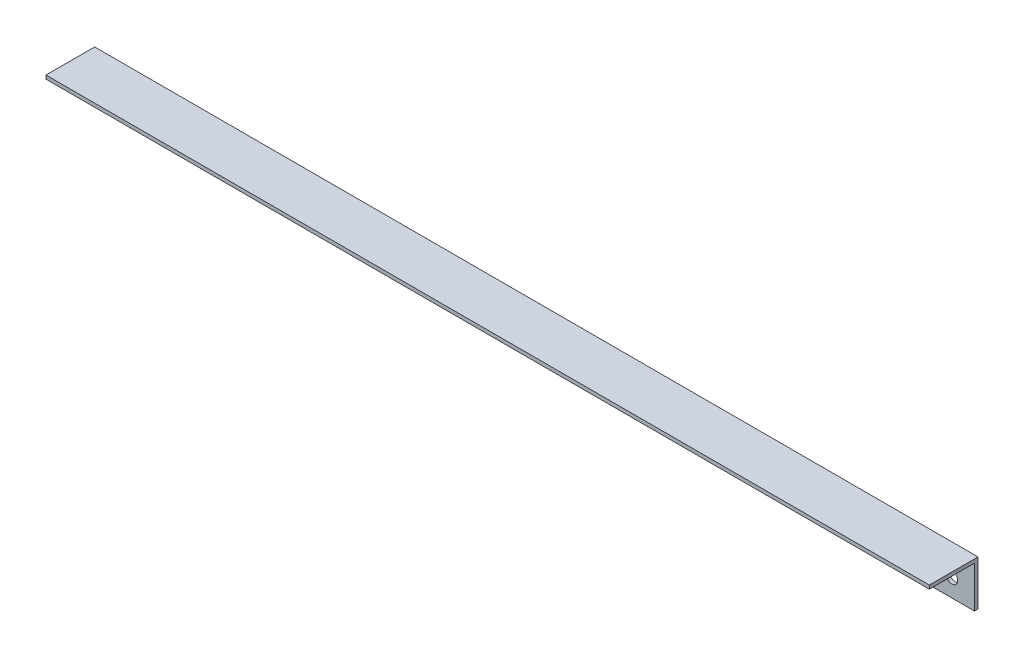
ISO-10303-21;
HEADER;
FILE_DESCRIPTION(('STEP AP214'),'2;1');
FILE_NAME('part.step','',(''),(''),'','','');
FILE_SCHEMA(('AUTOMOTIVE_DESIGN { 1 0 10303 214 1 1 1 1 }'));
ENDSEC;
DATA;
#1=APPLICATION_CONTEXT('core data for automotive mechanical design processes');
#2=APPLICATION_PROTOCOL_DEFINITION('international standard','automotive_design',2000,#1);
#3=PRODUCT_CONTEXT('',#1,'mechanical');
#4=PRODUCT('Part','Part','',(#3));
#5=PRODUCT_RELATED_PRODUCT_CATEGORY('part','',(#4));
#6=PRODUCT_DEFINITION_FORMATION('','',#4);
#7=PRODUCT_DEFINITION_CONTEXT('part definition',#1,'design');
#8=PRODUCT_DEFINITION('design','',#6,#7);
#9=PRODUCT_DEFINITION_SHAPE('','',#8);
#10=(LENGTH_UNIT() NAMED_UNIT(*) SI_UNIT(.MILLI.,.METRE.));
#11=(NAMED_UNIT(*) PLANE_ANGLE_UNIT() SI_UNIT($,.RADIAN.));
#12=(NAMED_UNIT(*) SI_UNIT($,.STERADIAN.) SOLID_ANGLE_UNIT());
#13=UNCERTAINTY_MEASURE_WITH_UNIT(LENGTH_MEASURE(1.E-05),#10,'distance_accuracy_value','');
#14=(GEOMETRIC_REPRESENTATION_CONTEXT(3) GLOBAL_UNCERTAINTY_ASSIGNED_CONTEXT((#13)) GLOBAL_UNIT_ASSIGNED_CONTEXT((#10,
#11,#12)) REPRESENTATION_CONTEXT('',''));
#15=CARTESIAN_POINT('',(0.,0.,0.));
#16=DIRECTION('',(0.,0.,1.));
#17=DIRECTION('',(1.,0.,0.));
#18=AXIS2_PLACEMENT_3D('',#15,#16,#17);
#19=CARTESIAN_POINT('',(-980.,-5.48788481732075,8.));
#20=DIRECTION('',(0.,0.,1.));
#21=DIRECTION('',(1.,0.,0.));
#22=AXIS2_PLACEMENT_3D('',#19,#20,#21);
#23=PLANE('',#22);
#24=DIRECTION('',(1.,0.,0.));
#25=VECTOR('',#24,1.);
#26=CARTESIAN_POINT('',(-980.,86.5121151826793,8.));
#27=LINE('',#26,#25);
#28=CARTESIAN_POINT('',(-980.,86.5121151826793,8.));
#29=VERTEX_POINT('',#28);
#30=CARTESIAN_POINT('',(980.,86.5121151826793,8.));
#31=VERTEX_POINT('',#30);
#32=EDGE_CURVE('E49',#29,#31,#27,.T.);
#33=ORIENTED_EDGE('',*,*,#32,.F.);
#34=DIRECTION('',(0.,-1.,0.));
#35=VECTOR('',#34,1.);
#36=CARTESIAN_POINT('',(-980.,94.5121151826794,8.));
#37=LINE('',#36,#35);
#38=CARTESIAN_POINT('',(-980.,-5.48788481732075,8.));
#39=VERTEX_POINT('',#38);
#40=EDGE_CURVE('E86',#29,#39,#37,.T.);
#41=ORIENTED_EDGE('',*,*,#40,.T.);
#42=DIRECTION('',(1.,0.,0.));
#43=VECTOR('',#42,1.);
#44=CARTESIAN_POINT('',(-980.,-5.48788481732075,8.));
#45=LINE('',#44,#43);
#46=CARTESIAN_POINT('',(980.,-5.48788481732075,8.));
#47=VERTEX_POINT('',#46);
#48=EDGE_CURVE('E55',#39,#47,#45,.T.);
#49=ORIENTED_EDGE('',*,*,#48,.T.);
#50=DIRECTION('',(0.,1.,0.));
#51=VECTOR('',#50,1.);
#52=CARTESIAN_POINT('',(980.,94.5121151826794,8.));
#53=LINE('',#52,#51);
#54=EDGE_CURVE('E97',#47,#31,#53,.T.);
#55=ORIENTED_EDGE('',*,*,#54,.T.);
#56=EDGE_LOOP('',(#33,#41,#49,#55));
#57=FACE_BOUND('',#56,.T.);
#58=CARTESIAN_POINT('',(-330.,34.5121151826793,8.));
#59=DIRECTION('',(0.,0.,1.));
#60=DIRECTION('',(-1.,0.,0.));
#61=AXIS2_PLACEMENT_3D('',#58,#59,#60);
#62=CIRCLE('',#61,13.);
#63=CARTESIAN_POINT('',(-343.,34.5121151826793,8.));
#64=VERTEX_POINT('',#63);
#65=EDGE_CURVE('E155',#64,#64,#62,.T.);
#66=ORIENTED_EDGE('',*,*,#65,.F.);
#67=EDGE_LOOP('',(#66));
#68=FACE_BOUND('',#67,.T.);
#69=CARTESIAN_POINT('',(-170.,34.5121151826792,8.));
#70=DIRECTION('',(0.,0.,1.));
#71=DIRECTION('',(-1.,0.,0.));
#72=AXIS2_PLACEMENT_3D('',#69,#70,#71);
#73=CIRCLE('',#72,13.);
#74=CARTESIAN_POINT('',(-183.,34.5121151826792,8.));
#75=VERTEX_POINT('',#74);
#76=EDGE_CURVE('E167',#75,#75,#73,.T.);
#77=ORIENTED_EDGE('',*,*,#76,.F.);
#78=EDGE_LOOP('',(#77));
#79=FACE_BOUND('',#78,.T.);
#80=CARTESIAN_POINT('',(-850.,34.5121151826793,8.));
#81=DIRECTION('',(0.,0.,1.));
#82=DIRECTION('',(-1.,0.,0.));
#83=AXIS2_PLACEMENT_3D('',#80,#81,#82);
#84=CIRCLE('',#83,13.);
#85=CARTESIAN_POINT('',(-863.,34.5121151826793,8.));
#86=VERTEX_POINT('',#85);
#87=EDGE_CURVE('E179',#86,#86,#84,.T.);
#88=ORIENTED_EDGE('',*,*,#87,.F.);
#89=EDGE_LOOP('',(#88));
#90=FACE_BOUND('',#89,.T.);
#91=CARTESIAN_POINT('',(250.,34.5121151826793,8.));
#92=DIRECTION('',(0.,0.,1.));
#93=DIRECTION('',(1.,0.,0.));
#94=AXIS2_PLACEMENT_3D('',#91,#92,#93);
#95=CIRCLE('',#94,13.);
#96=CARTESIAN_POINT('',(263.,34.5121151826793,8.));
#97=VERTEX_POINT('',#96);
#98=EDGE_CURVE('E191',#97,#97,#95,.T.);
#99=ORIENTED_EDGE('',*,*,#98,.F.);
#100=EDGE_LOOP('',(#99));
#101=FACE_BOUND('',#100,.T.);
#102=CARTESIAN_POINT('',(770.,34.5121151826793,8.));
#103=DIRECTION('',(0.,0.,1.));
#104=DIRECTION('',(1.,0.,0.));
#105=AXIS2_PLACEMENT_3D('',#102,#103,#104);
#106=CIRCLE('',#105,13.);
#107=CARTESIAN_POINT('',(783.,34.5121151826793,8.));
#108=VERTEX_POINT('',#107);
#109=EDGE_CURVE('E203',#108,#108,#106,.T.);
#110=ORIENTED_EDGE('',*,*,#109,.F.);
#111=EDGE_LOOP('',(#110));
#112=FACE_BOUND('',#111,.T.);
#113=CARTESIAN_POINT('',(930.,34.5121151826793,8.));
#114=DIRECTION('',(0.,0.,1.));
#115=DIRECTION('',(1.,0.,0.));
#116=AXIS2_PLACEMENT_3D('',#113,#114,#115);
#117=CIRCLE('',#116,13.);
#118=CARTESIAN_POINT('',(943.,34.5121151826793,8.));
#119=VERTEX_POINT('',#118);
#120=EDGE_CURVE('E102',#119,#119,#117,.T.);
#121=ORIENTED_EDGE('',*,*,#120,.F.);
#122=EDGE_LOOP('',(#121));
#123=FACE_BOUND('',#122,.T.);
#124=CARTESIAN_POINT('',(850.,34.5121151826793,8.));
#125=DIRECTION('',(0.,0.,1.));
#126=DIRECTION('',(1.,0.,0.));
#127=AXIS2_PLACEMENT_3D('',#124,#125,#126);
#128=CIRCLE('',#127,13.);
#129=CARTESIAN_POINT('',(863.,34.5121151826793,8.));
#130=VERTEX_POINT('',#129);
#131=EDGE_CURVE('E209',#130,#130,#128,.T.);
#132=ORIENTED_EDGE('',*,*,#131,.F.);
#133=EDGE_LOOP('',(#132));
#134=FACE_BOUND('',#133,.T.);
#135=CARTESIAN_POINT('',(330.,34.5121151826793,8.));
#136=DIRECTION('',(0.,0.,1.));
#137=DIRECTION('',(1.,0.,0.));
#138=AXIS2_PLACEMENT_3D('',#135,#136,#137);
#139=CIRCLE('',#138,13.);
#140=CARTESIAN_POINT('',(343.,34.5121151826793,8.));
#141=VERTEX_POINT('',#140);
#142=EDGE_CURVE('E197',#141,#141,#139,.T.);
#143=ORIENTED_EDGE('',*,*,#142,.F.);
#144=EDGE_LOOP('',(#143));
#145=FACE_BOUND('',#144,.T.);
#146=CARTESIAN_POINT('',(-770.,34.5121151826793,8.));
#147=DIRECTION('',(0.,0.,1.));
#148=DIRECTION('',(-1.,0.,0.));
#149=AXIS2_PLACEMENT_3D('',#146,#147,#148);
#150=CIRCLE('',#149,13.);
#151=CARTESIAN_POINT('',(-783.,34.5121151826793,8.));
#152=VERTEX_POINT('',#151);
#153=EDGE_CURVE('E185',#152,#152,#150,.T.);
#154=ORIENTED_EDGE('',*,*,#153,.F.);
#155=EDGE_LOOP('',(#154));
#156=FACE_BOUND('',#155,.T.);
#157=CARTESIAN_POINT('',(170.,34.5121151826792,8.));
#158=DIRECTION('',(0.,0.,1.));
#159=DIRECTION('',(1.,0.,0.));
#160=AXIS2_PLACEMENT_3D('',#157,#158,#159);
#161=CIRCLE('',#160,13.);
#162=CARTESIAN_POINT('',(183.,34.5121151826792,8.));
#163=VERTEX_POINT('',#162);
#164=EDGE_CURVE('E173',#163,#163,#161,.T.);
#165=ORIENTED_EDGE('',*,*,#164,.F.);
#166=EDGE_LOOP('',(#165));
#167=FACE_BOUND('',#166,.T.);
#168=CARTESIAN_POINT('',(-250.,34.5121151826793,8.));
#169=DIRECTION('',(0.,0.,1.));
#170=DIRECTION('',(-1.,0.,0.));
#171=AXIS2_PLACEMENT_3D('',#168,#169,#170);
#172=CIRCLE('',#171,13.);
#173=CARTESIAN_POINT('',(-263.,34.5121151826793,8.));
#174=VERTEX_POINT('',#173);
#175=EDGE_CURVE('E161',#174,#174,#172,.T.);
#176=ORIENTED_EDGE('',*,*,#175,.F.);
#177=EDGE_LOOP('',(#176));
#178=FACE_BOUND('',#177,.T.);
#179=CARTESIAN_POINT('',(-930.,34.5121151826793,8.));
#180=DIRECTION('',(0.,0.,1.));
#181=DIRECTION('',(-1.,0.,0.));
#182=AXIS2_PLACEMENT_3D('',#179,#180,#181);
#183=CIRCLE('',#182,13.);
#184=CARTESIAN_POINT('',(-943.,34.5121151826793,8.));
#185=VERTEX_POINT('',#184);
#186=EDGE_CURVE('E149',#185,#185,#183,.T.);
#187=ORIENTED_EDGE('',*,*,#186,.F.);
#188=EDGE_LOOP('',(#187));
#189=FACE_BOUND('',#188,.T.);
#190=ADVANCED_FACE('F32',(#57,#68,#79,#90,#101,#112,#123,#134,#145,#156,#167,#178,#189),#23,.T.);
#191=CARTESIAN_POINT('',(-980.,-5.48788481732075,0.));
#192=DIRECTION('',(0.,0.,1.));
#193=DIRECTION('',(1.,0.,0.));
#194=AXIS2_PLACEMENT_3D('',#191,#192,#193);
#195=PLANE('',#194);
#196=CARTESIAN_POINT('',(-330.,34.5121151826793,0.));
#197=DIRECTION('',(0.,0.,1.));
#198=DIRECTION('',(-1.,0.,0.));
#199=AXIS2_PLACEMENT_3D('',#196,#197,#198);
#200=CIRCLE('',#199,13.);
#201=CARTESIAN_POINT('',(-343.,34.5121151826793,0.));
#202=VERTEX_POINT('',#201);
#203=EDGE_CURVE('E152',#202,#202,#200,.T.);
#204=ORIENTED_EDGE('',*,*,#203,.T.);
#205=EDGE_LOOP('',(#204));
#206=FACE_BOUND('',#205,.T.);
#207=CARTESIAN_POINT('',(-170.,34.5121151826792,0.));
#208=DIRECTION('',(0.,0.,1.));
#209=DIRECTION('',(-1.,0.,0.));
#210=AXIS2_PLACEMENT_3D('',#207,#208,#209);
#211=CIRCLE('',#210,13.);
#212=CARTESIAN_POINT('',(-183.,34.5121151826792,0.));
#213=VERTEX_POINT('',#212);
#214=EDGE_CURVE('E164',#213,#213,#211,.T.);
#215=ORIENTED_EDGE('',*,*,#214,.T.);
#216=EDGE_LOOP('',(#215));
#217=FACE_BOUND('',#216,.T.);
#218=CARTESIAN_POINT('',(-850.,34.5121151826793,0.));
#219=DIRECTION('',(0.,0.,1.));
#220=DIRECTION('',(-1.,0.,0.));
#221=AXIS2_PLACEMENT_3D('',#218,#219,#220);
#222=CIRCLE('',#221,13.);
#223=CARTESIAN_POINT('',(-863.,34.5121151826793,0.));
#224=VERTEX_POINT('',#223);
#225=EDGE_CURVE('E176',#224,#224,#222,.T.);
#226=ORIENTED_EDGE('',*,*,#225,.T.);
#227=EDGE_LOOP('',(#226));
#228=FACE_BOUND('',#227,.T.);
#229=CARTESIAN_POINT('',(250.,34.5121151826793,0.));
#230=DIRECTION('',(0.,0.,1.));
#231=DIRECTION('',(1.,0.,0.));
#232=AXIS2_PLACEMENT_3D('',#229,#230,#231);
#233=CIRCLE('',#232,13.);
#234=CARTESIAN_POINT('',(263.,34.5121151826793,0.));
#235=VERTEX_POINT('',#234);
#236=EDGE_CURVE('E188',#235,#235,#233,.T.);
#237=ORIENTED_EDGE('',*,*,#236,.T.);
#238=EDGE_LOOP('',(#237));
#239=FACE_BOUND('',#238,.T.);
#240=CARTESIAN_POINT('',(770.,34.5121151826793,0.));
#241=DIRECTION('',(0.,0.,1.));
#242=DIRECTION('',(1.,0.,0.));
#243=AXIS2_PLACEMENT_3D('',#240,#241,#242);
#244=CIRCLE('',#243,13.);
#245=CARTESIAN_POINT('',(783.,34.5121151826793,0.));
#246=VERTEX_POINT('',#245);
#247=EDGE_CURVE('E200',#246,#246,#244,.T.);
#248=ORIENTED_EDGE('',*,*,#247,.T.);
#249=EDGE_LOOP('',(#248));
#250=FACE_BOUND('',#249,.T.);
#251=CARTESIAN_POINT('',(930.,34.5121151826793,0.));
#252=DIRECTION('',(0.,0.,1.));
#253=DIRECTION('',(1.,0.,0.));
#254=AXIS2_PLACEMENT_3D('',#251,#252,#253);
#255=CIRCLE('',#254,13.);
#256=CARTESIAN_POINT('',(943.,34.5121151826793,0.));
#257=VERTEX_POINT('',#256);
#258=EDGE_CURVE('E106',#257,#257,#255,.T.);
#259=ORIENTED_EDGE('',*,*,#258,.T.);
#260=EDGE_LOOP('',(#259));
#261=FACE_BOUND('',#260,.T.);
#262=DIRECTION('',(0.,-1.,0.));
#263=VECTOR('',#262,1.);
#264=CARTESIAN_POINT('',(-980.,94.5121151826794,0.));
#265=LINE('',#264,#263);
#266=CARTESIAN_POINT('',(-980.,94.5121151826794,0.));
#267=VERTEX_POINT('',#266);
#268=CARTESIAN_POINT('',(-980.,-5.48788481732075,0.));
#269=VERTEX_POINT('',#268);
#270=EDGE_CURVE('E93',#267,#269,#265,.T.);
#271=ORIENTED_EDGE('',*,*,#270,.F.);
#272=DIRECTION('',(-1.,0.,0.));
#273=VECTOR('',#272,1.);
#274=CARTESIAN_POINT('',(-980.,94.5121151826794,0.));
#275=LINE('',#274,#273);
#276=CARTESIAN_POINT('',(980.,94.5121151826794,0.));
#277=VERTEX_POINT('',#276);
#278=EDGE_CURVE('E75',#277,#267,#275,.T.);
#279=ORIENTED_EDGE('',*,*,#278,.F.);
#280=DIRECTION('',(0.,1.,0.));
#281=VECTOR('',#280,1.);
#282=CARTESIAN_POINT('',(980.,94.5121151826794,0.));
#283=LINE('',#282,#281);
#284=CARTESIAN_POINT('',(980.,-5.48788481732075,0.));
#285=VERTEX_POINT('',#284);
#286=EDGE_CURVE('E87',#285,#277,#283,.T.);
#287=ORIENTED_EDGE('',*,*,#286,.F.);
#288=DIRECTION('',(1.,0.,0.));
#289=VECTOR('',#288,1.);
#290=CARTESIAN_POINT('',(-980.,-5.48788481732075,0.));
#291=LINE('',#290,#289);
#292=EDGE_CURVE('E101',#269,#285,#291,.T.);
#293=ORIENTED_EDGE('',*,*,#292,.F.);
#294=EDGE_LOOP('',(#271,#279,#287,#293));
#295=FACE_BOUND('',#294,.T.);
#296=CARTESIAN_POINT('',(850.,34.5121151826793,0.));
#297=DIRECTION('',(0.,0.,1.));
#298=DIRECTION('',(1.,0.,0.));
#299=AXIS2_PLACEMENT_3D('',#296,#297,#298);
#300=CIRCLE('',#299,13.);
#301=CARTESIAN_POINT('',(863.,34.5121151826793,0.));
#302=VERTEX_POINT('',#301);
#303=EDGE_CURVE('E206',#302,#302,#300,.T.);
#304=ORIENTED_EDGE('',*,*,#303,.T.);
#305=EDGE_LOOP('',(#304));
#306=FACE_BOUND('',#305,.T.);
#307=CARTESIAN_POINT('',(330.,34.5121151826793,0.));
#308=DIRECTION('',(0.,0.,1.));
#309=DIRECTION('',(1.,0.,0.));
#310=AXIS2_PLACEMENT_3D('',#307,#308,#309);
#311=CIRCLE('',#310,13.);
#312=CARTESIAN_POINT('',(343.,34.5121151826793,0.));
#313=VERTEX_POINT('',#312);
#314=EDGE_CURVE('E194',#313,#313,#311,.T.);
#315=ORIENTED_EDGE('',*,*,#314,.T.);
#316=EDGE_LOOP('',(#315));
#317=FACE_BOUND('',#316,.T.);
#318=CARTESIAN_POINT('',(-770.,34.5121151826793,0.));
#319=DIRECTION('',(0.,0.,1.));
#320=DIRECTION('',(-1.,0.,0.));
#321=AXIS2_PLACEMENT_3D('',#318,#319,#320);
#322=CIRCLE('',#321,13.);
#323=CARTESIAN_POINT('',(-783.,34.5121151826793,0.));
#324=VERTEX_POINT('',#323);
#325=EDGE_CURVE('E182',#324,#324,#322,.T.);
#326=ORIENTED_EDGE('',*,*,#325,.T.);
#327=EDGE_LOOP('',(#326));
#328=FACE_BOUND('',#327,.T.);
#329=CARTESIAN_POINT('',(170.,34.5121151826792,0.));
#330=DIRECTION('',(0.,0.,1.));
#331=DIRECTION('',(1.,0.,0.));
#332=AXIS2_PLACEMENT_3D('',#329,#330,#331);
#333=CIRCLE('',#332,13.);
#334=CARTESIAN_POINT('',(183.,34.5121151826792,0.));
#335=VERTEX_POINT('',#334);
#336=EDGE_CURVE('E170',#335,#335,#333,.T.);
#337=ORIENTED_EDGE('',*,*,#336,.T.);
#338=EDGE_LOOP('',(#337));
#339=FACE_BOUND('',#338,.T.);
#340=CARTESIAN_POINT('',(-250.,34.5121151826793,0.));
#341=DIRECTION('',(0.,0.,1.));
#342=DIRECTION('',(-1.,0.,0.));
#343=AXIS2_PLACEMENT_3D('',#340,#341,#342);
#344=CIRCLE('',#343,13.);
#345=CARTESIAN_POINT('',(-263.,34.5121151826793,0.));
#346=VERTEX_POINT('',#345);
#347=EDGE_CURVE('E158',#346,#346,#344,.T.);
#348=ORIENTED_EDGE('',*,*,#347,.T.);
#349=EDGE_LOOP('',(#348));
#350=FACE_BOUND('',#349,.T.);
#351=CARTESIAN_POINT('',(-930.,34.5121151826793,0.));
#352=DIRECTION('',(0.,0.,1.));
#353=DIRECTION('',(-1.,0.,0.));
#354=AXIS2_PLACEMENT_3D('',#351,#352,#353);
#355=CIRCLE('',#354,13.);
#356=CARTESIAN_POINT('',(-943.,34.5121151826793,0.));
#357=VERTEX_POINT('',#356);
#358=EDGE_CURVE('E141',#357,#357,#355,.T.);
#359=ORIENTED_EDGE('',*,*,#358,.T.);
#360=EDGE_LOOP('',(#359));
#361=FACE_BOUND('',#360,.T.);
#362=ADVANCED_FACE('F99',(#206,#217,#228,#239,#250,#261,#295,#306,#317,#328,#339,#350,#361),
#195,.F.);
#363=CARTESIAN_POINT('',(-980.,94.5121151826794,8.));
#364=DIRECTION('',(1.,0.,0.));
#365=DIRECTION('',(0.,0.,-1.));
#366=AXIS2_PLACEMENT_3D('',#363,#364,#365);
#367=PLANE('',#366);
#368=ORIENTED_EDGE('',*,*,#270,.T.);
#369=DIRECTION('',(0.,0.,-1.));
#370=VECTOR('',#369,1.);
#371=CARTESIAN_POINT('',(-980.,-5.48788481732075,8.));
#372=LINE('',#371,#370);
#373=EDGE_CURVE('E11',#39,#269,#372,.T.);
#374=ORIENTED_EDGE('',*,*,#373,.F.);
#375=ORIENTED_EDGE('',*,*,#40,.F.);
#376=DIRECTION('',(0.,0.,-1.));
#377=VECTOR('',#376,1.);
#378=CARTESIAN_POINT('',(-980.,86.5121151826793,108.));
#379=LINE('',#378,#377);
#380=CARTESIAN_POINT('',(-980.,86.5121151826793,108.));
#381=VERTEX_POINT('',#380);
#382=EDGE_CURVE('E135',#381,#29,#379,.T.);
#383=ORIENTED_EDGE('',*,*,#382,.F.);
#384=DIRECTION('',(0.,-1.,0.));
#385=VECTOR('',#384,1.);
#386=CARTESIAN_POINT('',(-980.,94.5121151826794,108.));
#387=LINE('',#386,#385);
#388=CARTESIAN_POINT('',(-980.,94.5121151826794,108.));
#389=VERTEX_POINT('',#388);
#390=EDGE_CURVE('E96',#389,#381,#387,.T.);
#391=ORIENTED_EDGE('',*,*,#390,.F.);
#392=DIRECTION('',(0.,0.,-1.));
#393=VECTOR('',#392,1.);
#394=CARTESIAN_POINT('',(-980.,94.5121151826794,8.));
#395=LINE('',#394,#393);
#396=EDGE_CURVE('E79',#389,#267,#395,.T.);
#397=ORIENTED_EDGE('',*,*,#396,.T.);
#398=EDGE_LOOP('',(#368,#374,#375,#383,#391,#397));
#399=FACE_BOUND('',#398,.T.);
#400=ADVANCED_FACE('F34',(#399),#367,.F.);
#401=CARTESIAN_POINT('',(-980.,-5.48788481732075,8.));
#402=DIRECTION('',(0.,1.,0.));
#403=DIRECTION('',(0.,0.,1.));
#404=AXIS2_PLACEMENT_3D('',#401,#402,#403);
#405=PLANE('',#404);
#406=ORIENTED_EDGE('',*,*,#292,.T.);
#407=DIRECTION('',(0.,0.,-1.));
#408=VECTOR('',#407,1.);
#409=CARTESIAN_POINT('',(980.,-5.48788481732075,8.));
#410=LINE('',#409,#408);
#411=EDGE_CURVE('E41',#47,#285,#410,.T.);
#412=ORIENTED_EDGE('',*,*,#411,.F.);
#413=ORIENTED_EDGE('',*,*,#48,.F.);
#414=ORIENTED_EDGE('',*,*,#373,.T.);
#415=EDGE_LOOP('',(#406,#412,#413,#414));
#416=FACE_BOUND('',#415,.T.);
#417=ADVANCED_FACE('F242',(#416),#405,.F.);
#418=CARTESIAN_POINT('',(980.,94.5121151826794,8.));
#419=DIRECTION('',(-1.,0.,0.));
#420=DIRECTION('',(0.,0.,1.));
#421=AXIS2_PLACEMENT_3D('',#418,#419,#420);
#422=PLANE('',#421);
#423=ORIENTED_EDGE('',*,*,#286,.T.);
#424=DIRECTION('',(0.,0.,-1.));
#425=VECTOR('',#424,1.);
#426=CARTESIAN_POINT('',(980.,94.5121151826794,8.));
#427=LINE('',#426,#425);
#428=CARTESIAN_POINT('',(980.,94.5121151826794,108.));
#429=VERTEX_POINT('',#428);
#430=EDGE_CURVE('E82',#429,#277,#427,.T.);
#431=ORIENTED_EDGE('',*,*,#430,.F.);
#432=DIRECTION('',(0.,1.,0.));
#433=VECTOR('',#432,1.);
#434=CARTESIAN_POINT('',(980.,94.5121151826794,108.));
#435=LINE('',#434,#433);
#436=CARTESIAN_POINT('',(980.,86.5121151826793,108.));
#437=VERTEX_POINT('',#436);
#438=EDGE_CURVE('E138',#437,#429,#435,.T.);
#439=ORIENTED_EDGE('',*,*,#438,.F.);
#440=DIRECTION('',(0.,0.,-1.));
#441=VECTOR('',#440,1.);
#442=CARTESIAN_POINT('',(980.,86.5121151826793,108.));
#443=LINE('',#442,#441);
#444=EDGE_CURVE('E133',#437,#31,#443,.T.);
#445=ORIENTED_EDGE('',*,*,#444,.T.);
#446=ORIENTED_EDGE('',*,*,#54,.F.);
#447=ORIENTED_EDGE('',*,*,#411,.T.);
#448=EDGE_LOOP('',(#423,#431,#439,#445,#446,#447));
#449=FACE_BOUND('',#448,.T.);
#450=ADVANCED_FACE('F136',(#449),#422,.F.);
#451=CARTESIAN_POINT('',(-980.,94.5121151826794,8.));
#452=DIRECTION('',(0.,-1.,0.));
#453=DIRECTION('',(0.,0.,-1.));
#454=AXIS2_PLACEMENT_3D('',#451,#452,#453);
#455=PLANE('',#454);
#456=ORIENTED_EDGE('',*,*,#278,.T.);
#457=ORIENTED_EDGE('',*,*,#396,.F.);
#458=DIRECTION('',(-1.,0.,0.));
#459=VECTOR('',#458,1.);
#460=CARTESIAN_POINT('',(-980.,94.5121151826794,108.));
#461=LINE('',#460,#459);
#462=EDGE_CURVE('E139',#429,#389,#461,.T.);
#463=ORIENTED_EDGE('',*,*,#462,.F.);
#464=ORIENTED_EDGE('',*,*,#430,.T.);
#465=EDGE_LOOP('',(#456,#457,#463,#464));
#466=FACE_BOUND('',#465,.T.);
#467=ADVANCED_FACE('F77',(#466),#455,.F.);
#468=CARTESIAN_POINT('',(930.,34.5121151826793,8.));
#469=DIRECTION('',(0.,0.,-1.));
#470=DIRECTION('',(-1.,0.,0.));
#471=AXIS2_PLACEMENT_3D('',#468,#469,#470);
#472=CYLINDRICAL_SURFACE('',#471,13.);
#473=ORIENTED_EDGE('',*,*,#120,.T.);
#474=EDGE_LOOP('',(#473));
#475=FACE_BOUND('',#474,.T.);
#476=ORIENTED_EDGE('',*,*,#258,.F.);
#477=EDGE_LOOP('',(#476));
#478=FACE_BOUND('',#477,.T.);
#479=ADVANCED_FACE('F219',(#475,#478),#472,.F.);
#480=CARTESIAN_POINT('',(850.,34.5121151826793,8.));
#481=DIRECTION('',(0.,0.,-1.));
#482=DIRECTION('',(-1.,0.,0.));
#483=AXIS2_PLACEMENT_3D('',#480,#481,#482);
#484=CYLINDRICAL_SURFACE('',#483,13.);
#485=ORIENTED_EDGE('',*,*,#131,.T.);
#486=EDGE_LOOP('',(#485));
#487=FACE_BOUND('',#486,.T.);
#488=ORIENTED_EDGE('',*,*,#303,.F.);
#489=EDGE_LOOP('',(#488));
#490=FACE_BOUND('',#489,.T.);
#491=ADVANCED_FACE('F216',(#487,#490),#484,.F.);
#492=CARTESIAN_POINT('',(770.,34.5121151826793,8.));
#493=DIRECTION('',(0.,0.,-1.));
#494=DIRECTION('',(-1.,0.,0.));
#495=AXIS2_PLACEMENT_3D('',#492,#493,#494);
#496=CYLINDRICAL_SURFACE('',#495,13.);
#497=ORIENTED_EDGE('',*,*,#109,.T.);
#498=EDGE_LOOP('',(#497));
#499=FACE_BOUND('',#498,.T.);
#500=ORIENTED_EDGE('',*,*,#247,.F.);
#501=EDGE_LOOP('',(#500));
#502=FACE_BOUND('',#501,.T.);
#503=ADVANCED_FACE('F218',(#499,#502),#496,.F.);
#504=CARTESIAN_POINT('',(330.,34.5121151826793,8.));
#505=DIRECTION('',(0.,0.,-1.));
#506=DIRECTION('',(-1.,0.,0.));
#507=AXIS2_PLACEMENT_3D('',#504,#505,#506);
#508=CYLINDRICAL_SURFACE('',#507,13.);
#509=ORIENTED_EDGE('',*,*,#142,.T.);
#510=EDGE_LOOP('',(#509));
#511=FACE_BOUND('',#510,.T.);
#512=ORIENTED_EDGE('',*,*,#314,.F.);
#513=EDGE_LOOP('',(#512));
#514=FACE_BOUND('',#513,.T.);
#515=ADVANCED_FACE('F226',(#511,#514),#508,.F.);
#516=CARTESIAN_POINT('',(250.,34.5121151826793,8.));
#517=DIRECTION('',(0.,0.,-1.));
#518=DIRECTION('',(-1.,0.,0.));
#519=AXIS2_PLACEMENT_3D('',#516,#517,#518);
#520=CYLINDRICAL_SURFACE('',#519,13.);
#521=ORIENTED_EDGE('',*,*,#98,.T.);
#522=EDGE_LOOP('',(#521));
#523=FACE_BOUND('',#522,.T.);
#524=ORIENTED_EDGE('',*,*,#236,.F.);
#525=EDGE_LOOP('',(#524));
#526=FACE_BOUND('',#525,.T.);
#527=ADVANCED_FACE('F293',(#523,#526),#520,.F.);
#528=CARTESIAN_POINT('',(-770.,34.5121151826793,8.));
#529=DIRECTION('',(0.,0.,-1.));
#530=DIRECTION('',(-1.,0.,0.));
#531=AXIS2_PLACEMENT_3D('',#528,#529,#530);
#532=CYLINDRICAL_SURFACE('',#531,13.);
#533=ORIENTED_EDGE('',*,*,#153,.T.);
#534=EDGE_LOOP('',(#533));
#535=FACE_BOUND('',#534,.T.);
#536=ORIENTED_EDGE('',*,*,#325,.F.);
#537=EDGE_LOOP('',(#536));
#538=FACE_BOUND('',#537,.T.);
#539=ADVANCED_FACE('F289',(#535,#538),#532,.F.);
#540=CARTESIAN_POINT('',(-850.,34.5121151826793,8.));
#541=DIRECTION('',(0.,0.,-1.));
#542=DIRECTION('',(-1.,0.,0.));
#543=AXIS2_PLACEMENT_3D('',#540,#541,#542);
#544=CYLINDRICAL_SURFACE('',#543,13.);
#545=ORIENTED_EDGE('',*,*,#87,.T.);
#546=EDGE_LOOP('',(#545));
#547=FACE_BOUND('',#546,.T.);
#548=ORIENTED_EDGE('',*,*,#225,.F.);
#549=EDGE_LOOP('',(#548));
#550=FACE_BOUND('',#549,.T.);
#551=ADVANCED_FACE('F285',(#547,#550),#544,.F.);
#552=CARTESIAN_POINT('',(170.,34.5121151826792,8.));
#553=DIRECTION('',(0.,0.,-1.));
#554=DIRECTION('',(-1.,0.,0.));
#555=AXIS2_PLACEMENT_3D('',#552,#553,#554);
#556=CYLINDRICAL_SURFACE('',#555,13.);
#557=ORIENTED_EDGE('',*,*,#164,.T.);
#558=EDGE_LOOP('',(#557));
#559=FACE_BOUND('',#558,.T.);
#560=ORIENTED_EDGE('',*,*,#336,.F.);
#561=EDGE_LOOP('',(#560));
#562=FACE_BOUND('',#561,.T.);
#563=ADVANCED_FACE('F281',(#559,#562),#556,.F.);
#564=CARTESIAN_POINT('',(-170.,34.5121151826792,8.));
#565=DIRECTION('',(0.,0.,-1.));
#566=DIRECTION('',(-1.,0.,0.));
#567=AXIS2_PLACEMENT_3D('',#564,#565,#566);
#568=CYLINDRICAL_SURFACE('',#567,13.);
#569=ORIENTED_EDGE('',*,*,#76,.T.);
#570=EDGE_LOOP('',(#569));
#571=FACE_BOUND('',#570,.T.);
#572=ORIENTED_EDGE('',*,*,#214,.F.);
#573=EDGE_LOOP('',(#572));
#574=FACE_BOUND('',#573,.T.);
#575=ADVANCED_FACE('F277',(#571,#574),#568,.F.);
#576=CARTESIAN_POINT('',(-250.,34.5121151826793,8.));
#577=DIRECTION('',(0.,0.,-1.));
#578=DIRECTION('',(-1.,0.,0.));
#579=AXIS2_PLACEMENT_3D('',#576,#577,#578);
#580=CYLINDRICAL_SURFACE('',#579,13.);
#581=ORIENTED_EDGE('',*,*,#175,.T.);
#582=EDGE_LOOP('',(#581));
#583=FACE_BOUND('',#582,.T.);
#584=ORIENTED_EDGE('',*,*,#347,.F.);
#585=EDGE_LOOP('',(#584));
#586=FACE_BOUND('',#585,.T.);
#587=ADVANCED_FACE('F273',(#583,#586),#580,.F.);
#588=CARTESIAN_POINT('',(-330.,34.5121151826793,8.));
#589=DIRECTION('',(0.,0.,-1.));
#590=DIRECTION('',(-1.,0.,0.));
#591=AXIS2_PLACEMENT_3D('',#588,#589,#590);
#592=CYLINDRICAL_SURFACE('',#591,13.);
#593=ORIENTED_EDGE('',*,*,#65,.T.);
#594=EDGE_LOOP('',(#593));
#595=FACE_BOUND('',#594,.T.);
#596=ORIENTED_EDGE('',*,*,#203,.F.);
#597=EDGE_LOOP('',(#596));
#598=FACE_BOUND('',#597,.T.);
#599=ADVANCED_FACE('F269',(#595,#598),#592,.F.);
#600=CARTESIAN_POINT('',(-930.,34.5121151826793,8.));
#601=DIRECTION('',(0.,0.,-1.));
#602=DIRECTION('',(-1.,0.,0.));
#603=AXIS2_PLACEMENT_3D('',#600,#601,#602);
#604=CYLINDRICAL_SURFACE('',#603,13.);
#605=ORIENTED_EDGE('',*,*,#186,.T.);
#606=EDGE_LOOP('',(#605));
#607=FACE_BOUND('',#606,.T.);
#608=ORIENTED_EDGE('',*,*,#358,.F.);
#609=EDGE_LOOP('',(#608));
#610=FACE_BOUND('',#609,.T.);
#611=ADVANCED_FACE('F264',(#607,#610),#604,.F.);
#612=CARTESIAN_POINT('',(-980.,86.5121151826793,108.));
#613=DIRECTION('',(0.,1.,0.));
#614=DIRECTION('',(0.,0.,1.));
#615=AXIS2_PLACEMENT_3D('',#612,#613,#614);
#616=PLANE('',#615);
#617=ORIENTED_EDGE('',*,*,#32,.T.);
#618=ORIENTED_EDGE('',*,*,#444,.F.);
#619=DIRECTION('',(1.,0.,0.));
#620=VECTOR('',#619,1.);
#621=CARTESIAN_POINT('',(-980.,86.5121151826793,108.));
#622=LINE('',#621,#620);
#623=EDGE_CURVE('E253',#381,#437,#622,.T.);
#624=ORIENTED_EDGE('',*,*,#623,.F.);
#625=ORIENTED_EDGE('',*,*,#382,.T.);
#626=EDGE_LOOP('',(#617,#618,#624,#625));
#627=FACE_BOUND('',#626,.T.);
#628=ADVANCED_FACE('F130',(#627),#616,.F.);
#629=CARTESIAN_POINT('',(-980.,86.5121151826793,108.));
#630=DIRECTION('',(0.,0.,1.));
#631=DIRECTION('',(1.,0.,0.));
#632=AXIS2_PLACEMENT_3D('',#629,#630,#631);
#633=PLANE('',#632);
#634=ORIENTED_EDGE('',*,*,#390,.T.);
#635=ORIENTED_EDGE('',*,*,#623,.T.);
#636=ORIENTED_EDGE('',*,*,#438,.T.);
#637=ORIENTED_EDGE('',*,*,#462,.T.);
#638=EDGE_LOOP('',(#634,#635,#636,#637));
#639=FACE_BOUND('',#638,.T.);
#640=ADVANCED_FACE('F252',(#639),#633,.T.);
#641=CLOSED_SHELL('',(#190,#362,#400,#417,#450,#467,#479,#491,#503,#515,#527,#539,#551,#563,
#575,#587,#599,#611,#628,#640));
#642=MANIFOLD_SOLID_BREP('B2',#641);
#643=ADVANCED_BREP_SHAPE_REPRESENTATION('',(#18,#642),#14);
#644=SHAPE_DEFINITION_REPRESENTATION(#9,#643);
ENDSEC;
END-ISO-10303-21;
